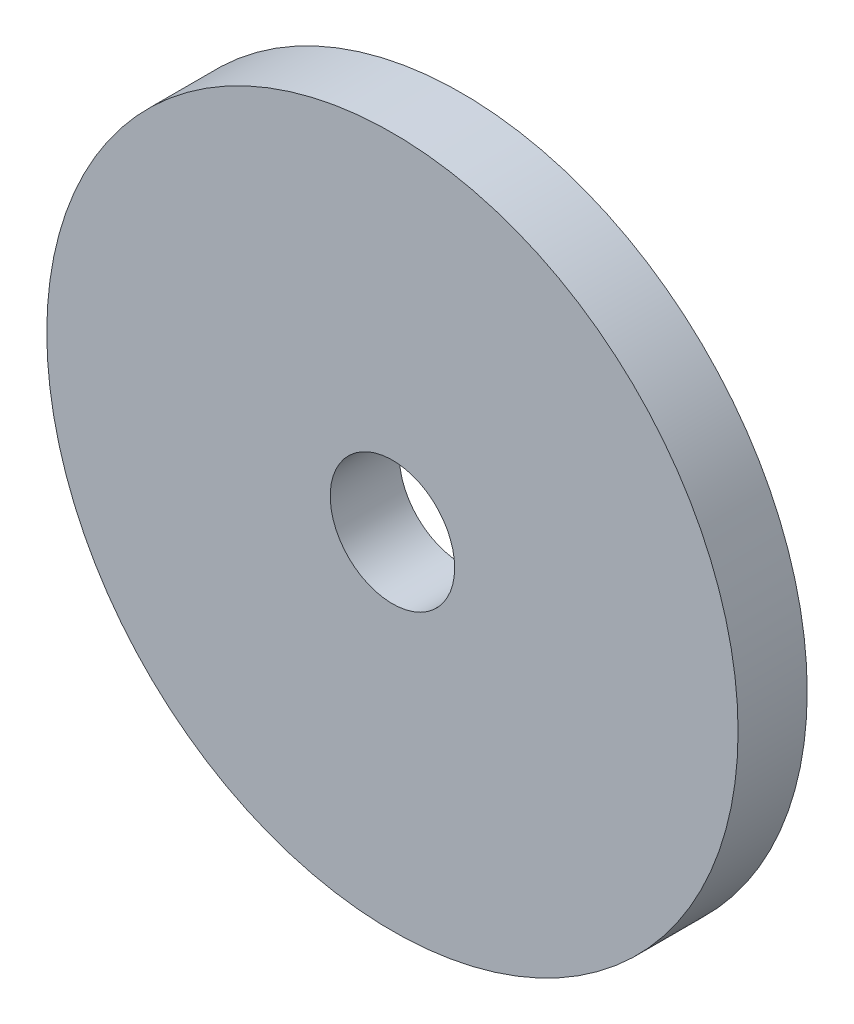
ISO-10303-21;
HEADER;
FILE_DESCRIPTION(('STEP AP214'),'2;1');
FILE_NAME('part.step','',(''),(''),'','','');
FILE_SCHEMA(('AUTOMOTIVE_DESIGN { 1 0 10303 214 1 1 1 1 }'));
ENDSEC;
DATA;
#1=APPLICATION_CONTEXT('core data for automotive mechanical design processes');
#2=APPLICATION_PROTOCOL_DEFINITION('international standard','automotive_design',2000,#1);
#3=PRODUCT_CONTEXT('',#1,'mechanical');
#4=PRODUCT('Part','Part','',(#3));
#5=PRODUCT_RELATED_PRODUCT_CATEGORY('part','',(#4));
#6=PRODUCT_DEFINITION_FORMATION('','',#4);
#7=PRODUCT_DEFINITION_CONTEXT('part definition',#1,'design');
#8=PRODUCT_DEFINITION('design','',#6,#7);
#9=PRODUCT_DEFINITION_SHAPE('','',#8);
#10=(LENGTH_UNIT() NAMED_UNIT(*) SI_UNIT(.MILLI.,.METRE.));
#11=(NAMED_UNIT(*) PLANE_ANGLE_UNIT() SI_UNIT($,.RADIAN.));
#12=(NAMED_UNIT(*) SI_UNIT($,.STERADIAN.) SOLID_ANGLE_UNIT());
#13=UNCERTAINTY_MEASURE_WITH_UNIT(LENGTH_MEASURE(1.E-05),#10,'distance_accuracy_value','');
#14=(GEOMETRIC_REPRESENTATION_CONTEXT(3) GLOBAL_UNCERTAINTY_ASSIGNED_CONTEXT((#13)) GLOBAL_UNIT_ASSIGNED_CONTEXT((#10,
#11,#12)) REPRESENTATION_CONTEXT('',''));
#15=CARTESIAN_POINT('',(0.,0.,0.));
#16=DIRECTION('',(0.,0.,1.));
#17=DIRECTION('',(1.,0.,0.));
#18=AXIS2_PLACEMENT_3D('',#15,#16,#17);
#19=CARTESIAN_POINT('',(0.,0.,5.));
#20=DIRECTION('',(0.,0.,1.));
#21=DIRECTION('',(1.,0.,0.));
#22=AXIS2_PLACEMENT_3D('',#19,#20,#21);
#23=PLANE('',#22);
#24=CARTESIAN_POINT('',(0.,0.,5.));
#25=DIRECTION('',(0.,0.,1.));
#26=DIRECTION('',(1.,0.,0.));
#27=AXIS2_PLACEMENT_3D('',#24,#25,#26);
#28=CIRCLE('',#27,25.);
#29=CARTESIAN_POINT('',(25.,0.,5.));
#30=VERTEX_POINT('',#29);
#31=EDGE_CURVE('E10',#30,#30,#28,.T.);
#32=ORIENTED_EDGE('',*,*,#31,.T.);
#33=EDGE_LOOP('',(#32));
#34=FACE_BOUND('',#33,.T.);
#35=CARTESIAN_POINT('',(0.,0.,5.));
#36=DIRECTION('',(0.,0.,1.));
#37=DIRECTION('',(1.,0.,0.));
#38=AXIS2_PLACEMENT_3D('',#35,#36,#37);
#39=CIRCLE('',#38,4.5);
#40=CARTESIAN_POINT('',(4.5,0.,5.));
#41=VERTEX_POINT('',#40);
#42=EDGE_CURVE('E57',#41,#41,#39,.T.);
#43=ORIENTED_EDGE('',*,*,#42,.F.);
#44=EDGE_LOOP('',(#43));
#45=FACE_BOUND('',#44,.T.);
#46=ADVANCED_FACE('F43',(#34,#45),#23,.T.);
#47=CARTESIAN_POINT('',(0.,0.,0.));
#48=DIRECTION('',(0.,0.,1.));
#49=DIRECTION('',(1.,0.,0.));
#50=AXIS2_PLACEMENT_3D('',#47,#48,#49);
#51=PLANE('',#50);
#52=CARTESIAN_POINT('',(0.,0.,0.));
#53=DIRECTION('',(0.,0.,1.));
#54=DIRECTION('',(1.,0.,0.));
#55=AXIS2_PLACEMENT_3D('',#52,#53,#54);
#56=CIRCLE('',#55,25.);
#57=CARTESIAN_POINT('',(25.,0.,0.));
#58=VERTEX_POINT('',#57);
#59=EDGE_CURVE('E47',#58,#58,#56,.T.);
#60=ORIENTED_EDGE('',*,*,#59,.F.);
#61=EDGE_LOOP('',(#60));
#62=FACE_BOUND('',#61,.T.);
#63=CARTESIAN_POINT('',(0.,0.,0.));
#64=DIRECTION('',(0.,0.,1.));
#65=DIRECTION('',(1.,0.,0.));
#66=AXIS2_PLACEMENT_3D('',#63,#64,#65);
#67=CIRCLE('',#66,4.5);
#68=CARTESIAN_POINT('',(4.5,0.,0.));
#69=VERTEX_POINT('',#68);
#70=EDGE_CURVE('E59',#69,#69,#67,.T.);
#71=ORIENTED_EDGE('',*,*,#70,.T.);
#72=EDGE_LOOP('',(#71));
#73=FACE_BOUND('',#72,.T.);
#74=ADVANCED_FACE('F72',(#62,#73),#51,.F.);
#75=CARTESIAN_POINT('',(0.,0.,5.));
#76=DIRECTION('',(0.,0.,-1.));
#77=DIRECTION('',(-1.,0.,0.));
#78=AXIS2_PLACEMENT_3D('',#75,#76,#77);
#79=CYLINDRICAL_SURFACE('',#78,25.);
#80=ORIENTED_EDGE('',*,*,#31,.F.);
#81=EDGE_LOOP('',(#80));
#82=FACE_BOUND('',#81,.T.);
#83=ORIENTED_EDGE('',*,*,#59,.T.);
#84=EDGE_LOOP('',(#83));
#85=FACE_BOUND('',#84,.T.);
#86=ADVANCED_FACE('F45',(#82,#85),#79,.T.);
#87=CARTESIAN_POINT('',(0.,0.,5.));
#88=DIRECTION('',(0.,0.,-1.));
#89=DIRECTION('',(-1.,0.,0.));
#90=AXIS2_PLACEMENT_3D('',#87,#88,#89);
#91=CYLINDRICAL_SURFACE('',#90,4.5);
#92=ORIENTED_EDGE('',*,*,#42,.T.);
#93=EDGE_LOOP('',(#92));
#94=FACE_BOUND('',#93,.T.);
#95=ORIENTED_EDGE('',*,*,#70,.F.);
#96=EDGE_LOOP('',(#95));
#97=FACE_BOUND('',#96,.T.);
#98=ADVANCED_FACE('F68',(#94,#97),#91,.F.);
#99=CLOSED_SHELL('',(#46,#74,#86,#98));
#100=MANIFOLD_SOLID_BREP('B2',#99);
#101=ADVANCED_BREP_SHAPE_REPRESENTATION('',(#18,#100),#14);
#102=SHAPE_DEFINITION_REPRESENTATION(#9,#101);
ENDSEC;
END-ISO-10303-21;
